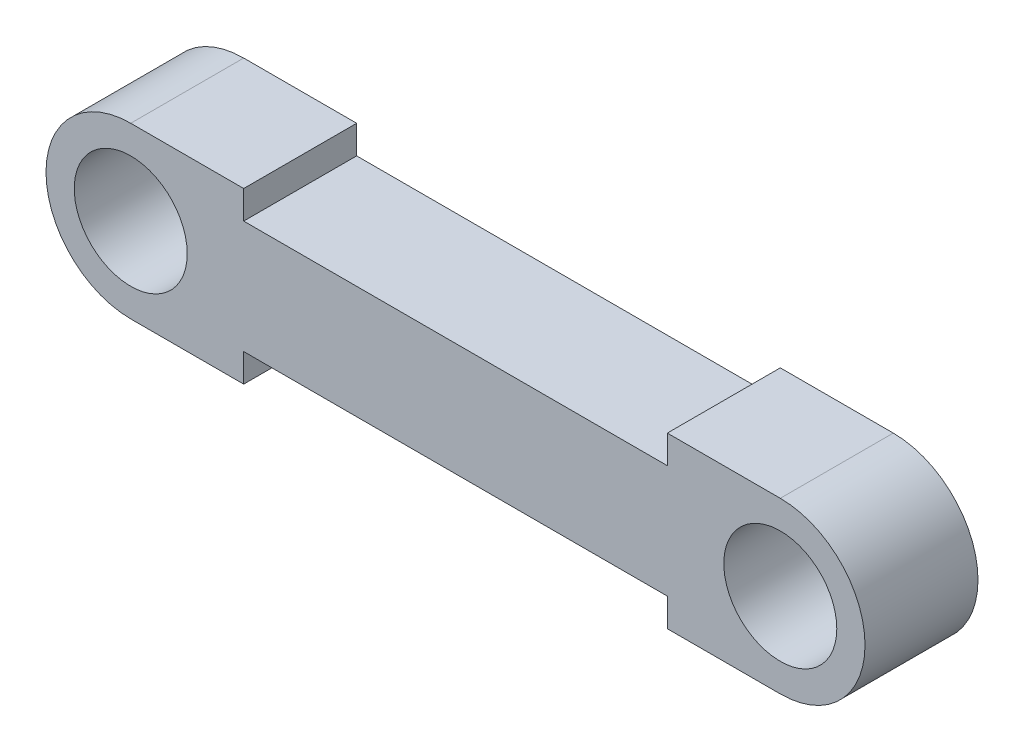
ISO-10303-21;
HEADER;
FILE_DESCRIPTION(('STEP AP214'),'2;1');
FILE_NAME('part.step','',(''),(''),'','','');
FILE_SCHEMA(('AUTOMOTIVE_DESIGN { 1 0 10303 214 1 1 1 1 }'));
ENDSEC;
DATA;
#1=APPLICATION_CONTEXT('core data for automotive mechanical design processes');
#2=APPLICATION_PROTOCOL_DEFINITION('international standard','automotive_design',2000,#1);
#3=PRODUCT_CONTEXT('',#1,'mechanical');
#4=PRODUCT('Part','Part','',(#3));
#5=PRODUCT_RELATED_PRODUCT_CATEGORY('part','',(#4));
#6=PRODUCT_DEFINITION_FORMATION('','',#4);
#7=PRODUCT_DEFINITION_CONTEXT('part definition',#1,'design');
#8=PRODUCT_DEFINITION('design','',#6,#7);
#9=PRODUCT_DEFINITION_SHAPE('','',#8);
#10=(LENGTH_UNIT() NAMED_UNIT(*) SI_UNIT(.MILLI.,.METRE.));
#11=(NAMED_UNIT(*) PLANE_ANGLE_UNIT() SI_UNIT($,.RADIAN.));
#12=(NAMED_UNIT(*) SI_UNIT($,.STERADIAN.) SOLID_ANGLE_UNIT());
#13=UNCERTAINTY_MEASURE_WITH_UNIT(LENGTH_MEASURE(1.E-05),#10,'distance_accuracy_value','');
#14=(GEOMETRIC_REPRESENTATION_CONTEXT(3) GLOBAL_UNCERTAINTY_ASSIGNED_CONTEXT((#13)) GLOBAL_UNIT_ASSIGNED_CONTEXT((#10,
#11,#12)) REPRESENTATION_CONTEXT('',''));
#15=CARTESIAN_POINT('',(0.,0.,0.));
#16=DIRECTION('',(0.,0.,1.));
#17=DIRECTION('',(1.,0.,0.));
#18=AXIS2_PLACEMENT_3D('',#15,#16,#17);
#19=CARTESIAN_POINT('',(0.,0.,2.));
#20=DIRECTION('',(0.,0.,1.));
#21=DIRECTION('',(1.,0.,0.));
#22=AXIS2_PLACEMENT_3D('',#19,#20,#21);
#23=PLANE('',#22);
#24=CARTESIAN_POINT('',(0.,0.,2.));
#25=DIRECTION('',(0.,0.,1.));
#26=DIRECTION('',(1.,0.,0.));
#27=AXIS2_PLACEMENT_3D('',#24,#25,#26);
#28=CIRCLE('',#27,2.);
#29=CARTESIAN_POINT('',(2.,0.,2.));
#30=VERTEX_POINT('',#29);
#31=EDGE_CURVE('E159',#30,#30,#28,.T.);
#32=ORIENTED_EDGE('',*,*,#31,.F.);
#33=EDGE_LOOP('',(#32));
#34=FACE_BOUND('',#33,.T.);
#35=CARTESIAN_POINT('',(0.,0.,2.));
#36=DIRECTION('',(0.,0.,1.));
#37=DIRECTION('',(1.,0.,0.));
#38=AXIS2_PLACEMENT_3D('',#35,#36,#37);
#39=CIRCLE('',#38,3.);
#40=CARTESIAN_POINT('',(0.,3.,2.));
#41=VERTEX_POINT('',#40);
#42=CARTESIAN_POINT('',(0.,-3.,2.));
#43=VERTEX_POINT('',#42);
#44=EDGE_CURVE('E178',#41,#43,#39,.T.);
#45=ORIENTED_EDGE('',*,*,#44,.T.);
#46=DIRECTION('',(1.,0.,0.));
#47=VECTOR('',#46,1.);
#48=CARTESIAN_POINT('',(0.,-3.,2.));
#49=LINE('',#48,#47);
#50=CARTESIAN_POINT('',(4.,-3.,2.));
#51=VERTEX_POINT('',#50);
#52=EDGE_CURVE('E106',#43,#51,#49,.T.);
#53=ORIENTED_EDGE('',*,*,#52,.T.);
#54=DIRECTION('',(0.,1.,0.));
#55=VECTOR('',#54,1.);
#56=CARTESIAN_POINT('',(4.,-3.,2.));
#57=LINE('',#56,#55);
#58=CARTESIAN_POINT('',(4.,-2.,2.));
#59=VERTEX_POINT('',#58);
#60=EDGE_CURVE('E205',#51,#59,#57,.T.);
#61=ORIENTED_EDGE('',*,*,#60,.T.);
#62=DIRECTION('',(1.,0.,0.));
#63=VECTOR('',#62,1.);
#64=CARTESIAN_POINT('',(4.,-2.,2.));
#65=LINE('',#64,#63);
#66=CARTESIAN_POINT('',(19.,-2.,2.));
#67=VERTEX_POINT('',#66);
#68=EDGE_CURVE('E224',#59,#67,#65,.T.);
#69=ORIENTED_EDGE('',*,*,#68,.T.);
#70=DIRECTION('',(0.,-1.,0.));
#71=VECTOR('',#70,1.);
#72=CARTESIAN_POINT('',(19.,-2.,2.));
#73=LINE('',#72,#71);
#74=CARTESIAN_POINT('',(19.,-3.,2.));
#75=VERTEX_POINT('',#74);
#76=EDGE_CURVE('E221',#67,#75,#73,.T.);
#77=ORIENTED_EDGE('',*,*,#76,.T.);
#78=DIRECTION('',(1.,0.,0.));
#79=VECTOR('',#78,1.);
#80=CARTESIAN_POINT('',(19.,-3.,2.));
#81=LINE('',#80,#79);
#82=CARTESIAN_POINT('',(23.,-3.,2.));
#83=VERTEX_POINT('',#82);
#84=EDGE_CURVE('E223',#75,#83,#81,.T.);
#85=ORIENTED_EDGE('',*,*,#84,.T.);
#86=CARTESIAN_POINT('',(23.,0.,2.));
#87=DIRECTION('',(0.,0.,1.));
#88=DIRECTION('',(1.,0.,0.));
#89=AXIS2_PLACEMENT_3D('',#86,#87,#88);
#90=CIRCLE('',#89,3.);
#91=CARTESIAN_POINT('',(23.,3.,2.));
#92=VERTEX_POINT('',#91);
#93=EDGE_CURVE('E226',#83,#92,#90,.T.);
#94=ORIENTED_EDGE('',*,*,#93,.T.);
#95=DIRECTION('',(-1.,0.,0.));
#96=VECTOR('',#95,1.);
#97=CARTESIAN_POINT('',(19.,3.,2.));
#98=LINE('',#97,#96);
#99=CARTESIAN_POINT('',(19.,3.,2.));
#100=VERTEX_POINT('',#99);
#101=EDGE_CURVE('E232',#92,#100,#98,.T.);
#102=ORIENTED_EDGE('',*,*,#101,.T.);
#103=DIRECTION('',(0.,-1.,0.));
#104=VECTOR('',#103,1.);
#105=CARTESIAN_POINT('',(19.,2.,2.));
#106=LINE('',#105,#104);
#107=CARTESIAN_POINT('',(19.,2.,2.));
#108=VERTEX_POINT('',#107);
#109=EDGE_CURVE('E137',#100,#108,#106,.T.);
#110=ORIENTED_EDGE('',*,*,#109,.T.);
#111=DIRECTION('',(-1.,0.,0.));
#112=VECTOR('',#111,1.);
#113=CARTESIAN_POINT('',(4.,2.,2.));
#114=LINE('',#113,#112);
#115=CARTESIAN_POINT('',(4.,2.,2.));
#116=VERTEX_POINT('',#115);
#117=EDGE_CURVE('E131',#108,#116,#114,.T.);
#118=ORIENTED_EDGE('',*,*,#117,.T.);
#119=DIRECTION('',(0.,1.,0.));
#120=VECTOR('',#119,1.);
#121=CARTESIAN_POINT('',(4.,3.,2.));
#122=LINE('',#121,#120);
#123=CARTESIAN_POINT('',(4.,3.,2.));
#124=VERTEX_POINT('',#123);
#125=EDGE_CURVE('E135',#116,#124,#122,.T.);
#126=ORIENTED_EDGE('',*,*,#125,.T.);
#127=DIRECTION('',(-1.,0.,0.));
#128=VECTOR('',#127,1.);
#129=CARTESIAN_POINT('',(0.,3.,2.));
#130=LINE('',#129,#128);
#131=EDGE_CURVE('E51',#124,#41,#130,.T.);
#132=ORIENTED_EDGE('',*,*,#131,.T.);
#133=EDGE_LOOP('',(#45,#53,#61,#69,#77,#85,#94,#102,#110,#118,#126,#132));
#134=FACE_BOUND('',#133,.T.);
#135=CARTESIAN_POINT('',(23.,0.,2.));
#136=DIRECTION('',(0.,0.,1.));
#137=DIRECTION('',(1.,0.,0.));
#138=AXIS2_PLACEMENT_3D('',#135,#136,#137);
#139=CIRCLE('',#138,2.);
#140=CARTESIAN_POINT('',(25.,0.,2.));
#141=VERTEX_POINT('',#140);
#142=EDGE_CURVE('E274',#141,#141,#139,.T.);
#143=ORIENTED_EDGE('',*,*,#142,.F.);
#144=EDGE_LOOP('',(#143));
#145=FACE_BOUND('',#144,.T.);
#146=ADVANCED_FACE('F34',(#34,#134,#145),#23,.T.);
#147=CARTESIAN_POINT('',(0.,0.,-2.));
#148=DIRECTION('',(0.,0.,1.));
#149=DIRECTION('',(1.,0.,0.));
#150=AXIS2_PLACEMENT_3D('',#147,#148,#149);
#151=PLANE('',#150);
#152=CARTESIAN_POINT('',(0.,0.,-2.));
#153=DIRECTION('',(0.,0.,1.));
#154=DIRECTION('',(1.,0.,0.));
#155=AXIS2_PLACEMENT_3D('',#152,#153,#154);
#156=CIRCLE('',#155,3.);
#157=CARTESIAN_POINT('',(0.,3.,-2.));
#158=VERTEX_POINT('',#157);
#159=CARTESIAN_POINT('',(0.,-3.,-2.));
#160=VERTEX_POINT('',#159);
#161=EDGE_CURVE('E155',#158,#160,#156,.T.);
#162=ORIENTED_EDGE('',*,*,#161,.F.);
#163=DIRECTION('',(-1.,0.,0.));
#164=VECTOR('',#163,1.);
#165=CARTESIAN_POINT('',(0.,3.,-2.));
#166=LINE('',#165,#164);
#167=CARTESIAN_POINT('',(4.,3.,-2.));
#168=VERTEX_POINT('',#167);
#169=EDGE_CURVE('E98',#168,#158,#166,.T.);
#170=ORIENTED_EDGE('',*,*,#169,.F.);
#171=DIRECTION('',(0.,1.,0.));
#172=VECTOR('',#171,1.);
#173=CARTESIAN_POINT('',(4.,3.,-2.));
#174=LINE('',#173,#172);
#175=CARTESIAN_POINT('',(4.,2.,-2.));
#176=VERTEX_POINT('',#175);
#177=EDGE_CURVE('E92',#176,#168,#174,.T.);
#178=ORIENTED_EDGE('',*,*,#177,.F.);
#179=DIRECTION('',(-1.,0.,0.));
#180=VECTOR('',#179,1.);
#181=CARTESIAN_POINT('',(4.,2.,-2.));
#182=LINE('',#181,#180);
#183=CARTESIAN_POINT('',(19.,2.,-2.));
#184=VERTEX_POINT('',#183);
#185=EDGE_CURVE('E145',#184,#176,#182,.T.);
#186=ORIENTED_EDGE('',*,*,#185,.F.);
#187=DIRECTION('',(0.,-1.,0.));
#188=VECTOR('',#187,1.);
#189=CARTESIAN_POINT('',(19.,2.,-2.));
#190=LINE('',#189,#188);
#191=CARTESIAN_POINT('',(19.,3.,-2.));
#192=VERTEX_POINT('',#191);
#193=EDGE_CURVE('E173',#192,#184,#190,.T.);
#194=ORIENTED_EDGE('',*,*,#193,.F.);
#195=DIRECTION('',(-1.,0.,0.));
#196=VECTOR('',#195,1.);
#197=CARTESIAN_POINT('',(19.,3.,-2.));
#198=LINE('',#197,#196);
#199=CARTESIAN_POINT('',(23.,3.,-2.));
#200=VERTEX_POINT('',#199);
#201=EDGE_CURVE('E171',#200,#192,#198,.T.);
#202=ORIENTED_EDGE('',*,*,#201,.F.);
#203=CARTESIAN_POINT('',(23.,0.,-2.));
#204=DIRECTION('',(0.,0.,1.));
#205=DIRECTION('',(1.,0.,0.));
#206=AXIS2_PLACEMENT_3D('',#203,#204,#205);
#207=CIRCLE('',#206,3.);
#208=CARTESIAN_POINT('',(23.,-3.,-2.));
#209=VERTEX_POINT('',#208);
#210=EDGE_CURVE('E169',#209,#200,#207,.T.);
#211=ORIENTED_EDGE('',*,*,#210,.F.);
#212=DIRECTION('',(1.,0.,0.));
#213=VECTOR('',#212,1.);
#214=CARTESIAN_POINT('',(19.,-3.,-2.));
#215=LINE('',#214,#213);
#216=CARTESIAN_POINT('',(19.,-3.,-2.));
#217=VERTEX_POINT('',#216);
#218=EDGE_CURVE('E167',#217,#209,#215,.T.);
#219=ORIENTED_EDGE('',*,*,#218,.F.);
#220=DIRECTION('',(0.,-1.,0.));
#221=VECTOR('',#220,1.);
#222=CARTESIAN_POINT('',(19.,-2.,-2.));
#223=LINE('',#222,#221);
#224=CARTESIAN_POINT('',(19.,-2.,-2.));
#225=VERTEX_POINT('',#224);
#226=EDGE_CURVE('E165',#225,#217,#223,.T.);
#227=ORIENTED_EDGE('',*,*,#226,.F.);
#228=DIRECTION('',(1.,0.,0.));
#229=VECTOR('',#228,1.);
#230=CARTESIAN_POINT('',(4.,-2.,-2.));
#231=LINE('',#230,#229);
#232=CARTESIAN_POINT('',(4.,-2.,-2.));
#233=VERTEX_POINT('',#232);
#234=EDGE_CURVE('E163',#233,#225,#231,.T.);
#235=ORIENTED_EDGE('',*,*,#234,.F.);
#236=DIRECTION('',(0.,1.,0.));
#237=VECTOR('',#236,1.);
#238=CARTESIAN_POINT('',(4.,-3.,-2.));
#239=LINE('',#238,#237);
#240=CARTESIAN_POINT('',(4.,-3.,-2.));
#241=VERTEX_POINT('',#240);
#242=EDGE_CURVE('E161',#241,#233,#239,.T.);
#243=ORIENTED_EDGE('',*,*,#242,.F.);
#244=DIRECTION('',(1.,0.,0.));
#245=VECTOR('',#244,1.);
#246=CARTESIAN_POINT('',(0.,-3.,-2.));
#247=LINE('',#246,#245);
#248=EDGE_CURVE('E158',#160,#241,#247,.T.);
#249=ORIENTED_EDGE('',*,*,#248,.F.);
#250=EDGE_LOOP('',(#162,#170,#178,#186,#194,#202,#211,#219,#227,#235,#243,#249));
#251=FACE_BOUND('',#250,.T.);
#252=CARTESIAN_POINT('',(0.,0.,-2.));
#253=DIRECTION('',(0.,0.,1.));
#254=DIRECTION('',(1.,0.,0.));
#255=AXIS2_PLACEMENT_3D('',#252,#253,#254);
#256=CIRCLE('',#255,2.);
#257=CARTESIAN_POINT('',(2.,0.,-2.));
#258=VERTEX_POINT('',#257);
#259=EDGE_CURVE('E280',#258,#258,#256,.T.);
#260=ORIENTED_EDGE('',*,*,#259,.T.);
#261=EDGE_LOOP('',(#260));
#262=FACE_BOUND('',#261,.T.);
#263=CARTESIAN_POINT('',(23.,0.,-2.));
#264=DIRECTION('',(0.,0.,1.));
#265=DIRECTION('',(1.,0.,0.));
#266=AXIS2_PLACEMENT_3D('',#263,#264,#265);
#267=CIRCLE('',#266,2.);
#268=CARTESIAN_POINT('',(25.,0.,-2.));
#269=VERTEX_POINT('',#268);
#270=EDGE_CURVE('E277',#269,#269,#267,.T.);
#271=ORIENTED_EDGE('',*,*,#270,.T.);
#272=EDGE_LOOP('',(#271));
#273=FACE_BOUND('',#272,.T.);
#274=ADVANCED_FACE('F209',(#251,#262,#273),#151,.F.);
#275=CARTESIAN_POINT('',(0.,0.,2.));
#276=DIRECTION('',(0.,0.,-1.));
#277=DIRECTION('',(-1.,0.,0.));
#278=AXIS2_PLACEMENT_3D('',#275,#276,#277);
#279=CYLINDRICAL_SURFACE('',#278,3.);
#280=ORIENTED_EDGE('',*,*,#161,.T.);
#281=DIRECTION('',(0.,0.,-1.));
#282=VECTOR('',#281,1.);
#283=CARTESIAN_POINT('',(0.,-3.,2.));
#284=LINE('',#283,#282);
#285=EDGE_CURVE('E11',#43,#160,#284,.T.);
#286=ORIENTED_EDGE('',*,*,#285,.F.);
#287=ORIENTED_EDGE('',*,*,#44,.F.);
#288=DIRECTION('',(0.,0.,-1.));
#289=VECTOR('',#288,1.);
#290=CARTESIAN_POINT('',(0.,3.,2.));
#291=LINE('',#290,#289);
#292=EDGE_CURVE('E151',#41,#158,#291,.T.);
#293=ORIENTED_EDGE('',*,*,#292,.T.);
#294=EDGE_LOOP('',(#280,#286,#287,#293));
#295=FACE_BOUND('',#294,.T.);
#296=ADVANCED_FACE('F36',(#295),#279,.T.);
#297=CARTESIAN_POINT('',(0.,-3.,2.));
#298=DIRECTION('',(0.,1.,0.));
#299=DIRECTION('',(0.,0.,1.));
#300=AXIS2_PLACEMENT_3D('',#297,#298,#299);
#301=PLANE('',#300);
#302=ORIENTED_EDGE('',*,*,#248,.T.);
#303=DIRECTION('',(0.,0.,-1.));
#304=VECTOR('',#303,1.);
#305=CARTESIAN_POINT('',(4.,-3.,2.));
#306=LINE('',#305,#304);
#307=EDGE_CURVE('E43',#51,#241,#306,.T.);
#308=ORIENTED_EDGE('',*,*,#307,.F.);
#309=ORIENTED_EDGE('',*,*,#52,.F.);
#310=ORIENTED_EDGE('',*,*,#285,.T.);
#311=EDGE_LOOP('',(#302,#308,#309,#310));
#312=FACE_BOUND('',#311,.T.);
#313=ADVANCED_FACE('F373',(#312),#301,.F.);
#314=CARTESIAN_POINT('',(4.,-3.,2.));
#315=DIRECTION('',(-1.,0.,0.));
#316=DIRECTION('',(0.,0.,1.));
#317=AXIS2_PLACEMENT_3D('',#314,#315,#316);
#318=PLANE('',#317);
#319=ORIENTED_EDGE('',*,*,#242,.T.);
#320=DIRECTION('',(0.,0.,-1.));
#321=VECTOR('',#320,1.);
#322=CARTESIAN_POINT('',(4.,-2.,2.));
#323=LINE('',#322,#321);
#324=EDGE_CURVE('E197',#59,#233,#323,.T.);
#325=ORIENTED_EDGE('',*,*,#324,.F.);
#326=ORIENTED_EDGE('',*,*,#60,.F.);
#327=ORIENTED_EDGE('',*,*,#307,.T.);
#328=EDGE_LOOP('',(#319,#325,#326,#327));
#329=FACE_BOUND('',#328,.T.);
#330=ADVANCED_FACE('F203',(#329),#318,.F.);
#331=CARTESIAN_POINT('',(4.,-2.,2.));
#332=DIRECTION('',(0.,1.,0.));
#333=DIRECTION('',(0.,0.,1.));
#334=AXIS2_PLACEMENT_3D('',#331,#332,#333);
#335=PLANE('',#334);
#336=ORIENTED_EDGE('',*,*,#234,.T.);
#337=DIRECTION('',(0.,0.,-1.));
#338=VECTOR('',#337,1.);
#339=CARTESIAN_POINT('',(19.,-2.,2.));
#340=LINE('',#339,#338);
#341=EDGE_CURVE('E194',#67,#225,#340,.T.);
#342=ORIENTED_EDGE('',*,*,#341,.F.);
#343=ORIENTED_EDGE('',*,*,#68,.F.);
#344=ORIENTED_EDGE('',*,*,#324,.T.);
#345=EDGE_LOOP('',(#336,#342,#343,#344));
#346=FACE_BOUND('',#345,.T.);
#347=ADVANCED_FACE('F215',(#346),#335,.F.);
#348=CARTESIAN_POINT('',(19.,-2.,2.));
#349=DIRECTION('',(1.,0.,0.));
#350=DIRECTION('',(0.,0.,-1.));
#351=AXIS2_PLACEMENT_3D('',#348,#349,#350);
#352=PLANE('',#351);
#353=ORIENTED_EDGE('',*,*,#226,.T.);
#354=DIRECTION('',(0.,0.,-1.));
#355=VECTOR('',#354,1.);
#356=CARTESIAN_POINT('',(19.,-3.,2.));
#357=LINE('',#356,#355);
#358=EDGE_CURVE('E191',#75,#217,#357,.T.);
#359=ORIENTED_EDGE('',*,*,#358,.F.);
#360=ORIENTED_EDGE('',*,*,#76,.F.);
#361=ORIENTED_EDGE('',*,*,#341,.T.);
#362=EDGE_LOOP('',(#353,#359,#360,#361));
#363=FACE_BOUND('',#362,.T.);
#364=ADVANCED_FACE('F219',(#363),#352,.F.);
#365=CARTESIAN_POINT('',(19.,-3.,2.));
#366=DIRECTION('',(0.,1.,0.));
#367=DIRECTION('',(0.,0.,1.));
#368=AXIS2_PLACEMENT_3D('',#365,#366,#367);
#369=PLANE('',#368);
#370=ORIENTED_EDGE('',*,*,#218,.T.);
#371=DIRECTION('',(0.,0.,-1.));
#372=VECTOR('',#371,1.);
#373=CARTESIAN_POINT('',(23.,-3.,2.));
#374=LINE('',#373,#372);
#375=EDGE_CURVE('E188',#83,#209,#374,.T.);
#376=ORIENTED_EDGE('',*,*,#375,.F.);
#377=ORIENTED_EDGE('',*,*,#84,.F.);
#378=ORIENTED_EDGE('',*,*,#358,.T.);
#379=EDGE_LOOP('',(#370,#376,#377,#378));
#380=FACE_BOUND('',#379,.T.);
#381=ADVANCED_FACE('F338',(#380),#369,.F.);
#382=CARTESIAN_POINT('',(23.,0.,2.));
#383=DIRECTION('',(0.,0.,-1.));
#384=DIRECTION('',(-1.,0.,0.));
#385=AXIS2_PLACEMENT_3D('',#382,#383,#384);
#386=CYLINDRICAL_SURFACE('',#385,3.);
#387=ORIENTED_EDGE('',*,*,#210,.T.);
#388=DIRECTION('',(0.,0.,-1.));
#389=VECTOR('',#388,1.);
#390=CARTESIAN_POINT('',(23.,3.,2.));
#391=LINE('',#390,#389);
#392=EDGE_CURVE('E185',#92,#200,#391,.T.);
#393=ORIENTED_EDGE('',*,*,#392,.F.);
#394=ORIENTED_EDGE('',*,*,#93,.F.);
#395=ORIENTED_EDGE('',*,*,#375,.T.);
#396=EDGE_LOOP('',(#387,#393,#394,#395));
#397=FACE_BOUND('',#396,.T.);
#398=ADVANCED_FACE('F329',(#397),#386,.T.);
#399=CARTESIAN_POINT('',(19.,3.,2.));
#400=DIRECTION('',(0.,-1.,0.));
#401=DIRECTION('',(0.,0.,-1.));
#402=AXIS2_PLACEMENT_3D('',#399,#400,#401);
#403=PLANE('',#402);
#404=ORIENTED_EDGE('',*,*,#201,.T.);
#405=DIRECTION('',(0.,0.,-1.));
#406=VECTOR('',#405,1.);
#407=CARTESIAN_POINT('',(19.,3.,2.));
#408=LINE('',#407,#406);
#409=EDGE_CURVE('E182',#100,#192,#408,.T.);
#410=ORIENTED_EDGE('',*,*,#409,.F.);
#411=ORIENTED_EDGE('',*,*,#101,.F.);
#412=ORIENTED_EDGE('',*,*,#392,.T.);
#413=EDGE_LOOP('',(#404,#410,#411,#412));
#414=FACE_BOUND('',#413,.T.);
#415=ADVANCED_FACE('F238',(#414),#403,.F.);
#416=CARTESIAN_POINT('',(19.,2.,2.));
#417=DIRECTION('',(1.,0.,0.));
#418=DIRECTION('',(0.,0.,-1.));
#419=AXIS2_PLACEMENT_3D('',#416,#417,#418);
#420=PLANE('',#419);
#421=ORIENTED_EDGE('',*,*,#193,.T.);
#422=DIRECTION('',(0.,0.,-1.));
#423=VECTOR('',#422,1.);
#424=CARTESIAN_POINT('',(19.,2.,2.));
#425=LINE('',#424,#423);
#426=EDGE_CURVE('E146',#108,#184,#425,.T.);
#427=ORIENTED_EDGE('',*,*,#426,.F.);
#428=ORIENTED_EDGE('',*,*,#109,.F.);
#429=ORIENTED_EDGE('',*,*,#409,.T.);
#430=EDGE_LOOP('',(#421,#427,#428,#429));
#431=FACE_BOUND('',#430,.T.);
#432=ADVANCED_FACE('F242',(#431),#420,.F.);
#433=CARTESIAN_POINT('',(4.,2.,2.));
#434=DIRECTION('',(0.,-1.,0.));
#435=DIRECTION('',(0.,0.,-1.));
#436=AXIS2_PLACEMENT_3D('',#433,#434,#435);
#437=PLANE('',#436);
#438=ORIENTED_EDGE('',*,*,#185,.T.);
#439=DIRECTION('',(0.,0.,-1.));
#440=VECTOR('',#439,1.);
#441=CARTESIAN_POINT('',(4.,2.,2.));
#442=LINE('',#441,#440);
#443=EDGE_CURVE('E142',#116,#176,#442,.T.);
#444=ORIENTED_EDGE('',*,*,#443,.F.);
#445=ORIENTED_EDGE('',*,*,#117,.F.);
#446=ORIENTED_EDGE('',*,*,#426,.T.);
#447=EDGE_LOOP('',(#438,#444,#445,#446));
#448=FACE_BOUND('',#447,.T.);
#449=ADVANCED_FACE('F143',(#448),#437,.F.);
#450=CARTESIAN_POINT('',(4.,3.,2.));
#451=DIRECTION('',(-1.,0.,0.));
#452=DIRECTION('',(0.,0.,1.));
#453=AXIS2_PLACEMENT_3D('',#450,#451,#452);
#454=PLANE('',#453);
#455=ORIENTED_EDGE('',*,*,#177,.T.);
#456=DIRECTION('',(0.,0.,-1.));
#457=VECTOR('',#456,1.);
#458=CARTESIAN_POINT('',(4.,3.,2.));
#459=LINE('',#458,#457);
#460=EDGE_CURVE('E147',#124,#168,#459,.T.);
#461=ORIENTED_EDGE('',*,*,#460,.F.);
#462=ORIENTED_EDGE('',*,*,#125,.F.);
#463=ORIENTED_EDGE('',*,*,#443,.T.);
#464=EDGE_LOOP('',(#455,#461,#462,#463));
#465=FACE_BOUND('',#464,.T.);
#466=ADVANCED_FACE('F149',(#465),#454,.F.);
#467=CARTESIAN_POINT('',(0.,3.,2.));
#468=DIRECTION('',(0.,-1.,0.));
#469=DIRECTION('',(0.,0.,-1.));
#470=AXIS2_PLACEMENT_3D('',#467,#468,#469);
#471=PLANE('',#470);
#472=ORIENTED_EDGE('',*,*,#169,.T.);
#473=ORIENTED_EDGE('',*,*,#292,.F.);
#474=ORIENTED_EDGE('',*,*,#131,.F.);
#475=ORIENTED_EDGE('',*,*,#460,.T.);
#476=EDGE_LOOP('',(#472,#473,#474,#475));
#477=FACE_BOUND('',#476,.T.);
#478=ADVANCED_FACE('F246',(#477),#471,.F.);
#479=CARTESIAN_POINT('',(0.,0.,2.));
#480=DIRECTION('',(0.,0.,-1.));
#481=DIRECTION('',(-1.,0.,0.));
#482=AXIS2_PLACEMENT_3D('',#479,#480,#481);
#483=CYLINDRICAL_SURFACE('',#482,2.);
#484=ORIENTED_EDGE('',*,*,#31,.T.);
#485=EDGE_LOOP('',(#484));
#486=FACE_BOUND('',#485,.T.);
#487=ORIENTED_EDGE('',*,*,#259,.F.);
#488=EDGE_LOOP('',(#487));
#489=FACE_BOUND('',#488,.T.);
#490=ADVANCED_FACE('F248',(#486,#489),#483,.F.);
#491=CARTESIAN_POINT('',(23.,0.,2.));
#492=DIRECTION('',(0.,0.,-1.));
#493=DIRECTION('',(-1.,0.,0.));
#494=AXIS2_PLACEMENT_3D('',#491,#492,#493);
#495=CYLINDRICAL_SURFACE('',#494,2.);
#496=ORIENTED_EDGE('',*,*,#142,.T.);
#497=EDGE_LOOP('',(#496));
#498=FACE_BOUND('',#497,.T.);
#499=ORIENTED_EDGE('',*,*,#270,.F.);
#500=EDGE_LOOP('',(#499));
#501=FACE_BOUND('',#500,.T.);
#502=ADVANCED_FACE('F254',(#498,#501),#495,.F.);
#503=CLOSED_SHELL('',(#146,#274,#296,#313,#330,#347,#364,#381,#398,#415,#432,#449,#466,#478,
#490,#502));
#504=MANIFOLD_SOLID_BREP('B2',#503);
#505=ADVANCED_BREP_SHAPE_REPRESENTATION('',(#18,#504),#14);
#506=SHAPE_DEFINITION_REPRESENTATION(#9,#505);
ENDSEC;
END-ISO-10303-21;
